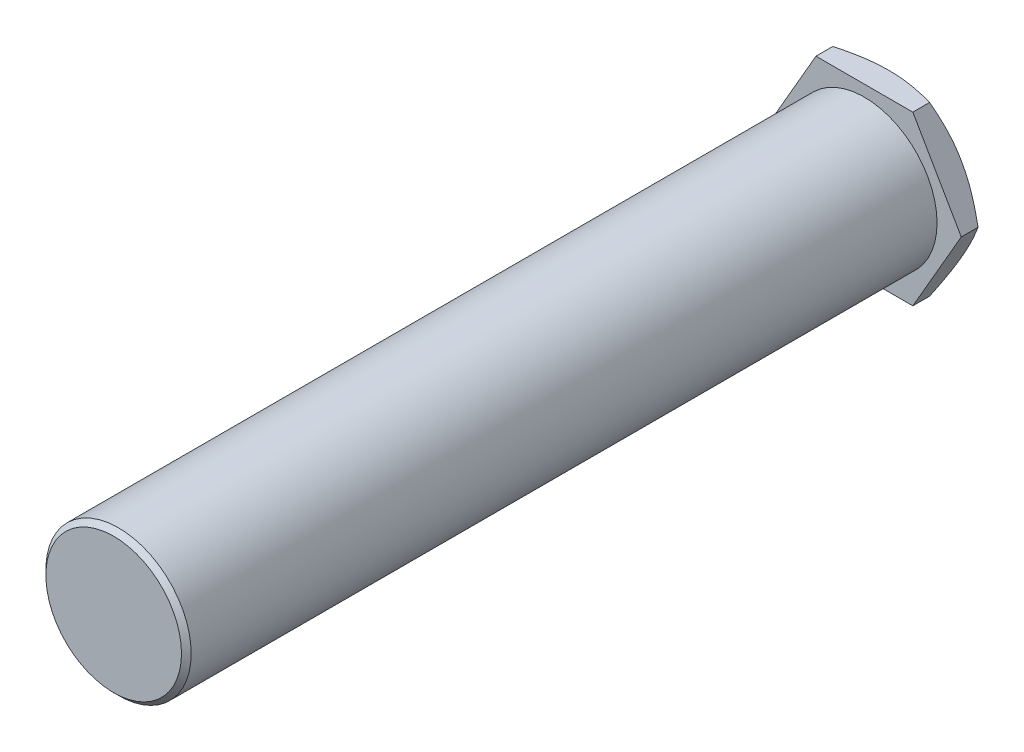
ISO-10303-21;
HEADER;
FILE_DESCRIPTION(('STEP AP214'),'2;1');
FILE_NAME('part.step','',(''),(''),'','','');
FILE_SCHEMA(('AUTOMOTIVE_DESIGN { 1 0 10303 214 1 1 1 1 }'));
ENDSEC;
DATA;
#1=APPLICATION_CONTEXT('core data for automotive mechanical design processes');
#2=APPLICATION_PROTOCOL_DEFINITION('international standard','automotive_design',2000,#1);
#3=PRODUCT_CONTEXT('',#1,'mechanical');
#4=PRODUCT('Part','Part','',(#3));
#5=PRODUCT_RELATED_PRODUCT_CATEGORY('part','',(#4));
#6=PRODUCT_DEFINITION_FORMATION('','',#4);
#7=PRODUCT_DEFINITION_CONTEXT('part definition',#1,'design');
#8=PRODUCT_DEFINITION('design','',#6,#7);
#9=PRODUCT_DEFINITION_SHAPE('','',#8);
#10=(LENGTH_UNIT() NAMED_UNIT(*) SI_UNIT(.MILLI.,.METRE.));
#11=(NAMED_UNIT(*) PLANE_ANGLE_UNIT() SI_UNIT($,.RADIAN.));
#12=(NAMED_UNIT(*) SI_UNIT($,.STERADIAN.) SOLID_ANGLE_UNIT());
#13=UNCERTAINTY_MEASURE_WITH_UNIT(LENGTH_MEASURE(1.E-05),#10,'distance_accuracy_value','');
#14=(GEOMETRIC_REPRESENTATION_CONTEXT(3) GLOBAL_UNCERTAINTY_ASSIGNED_CONTEXT((#13)) GLOBAL_UNIT_ASSIGNED_CONTEXT((#10,
#11,#12)) REPRESENTATION_CONTEXT('',''));
#15=CARTESIAN_POINT('',(0.,0.,0.));
#16=DIRECTION('',(0.,0.,1.));
#17=DIRECTION('',(1.,0.,0.));
#18=AXIS2_PLACEMENT_3D('',#15,#16,#17);
#19=CARTESIAN_POINT('',(20.,0.,5.));
#20=DIRECTION('',(-0.866025403784438,-0.5,0.));
#21=DIRECTION('',(0.5,-0.866025403784439,0.));
#22=AXIS2_PLACEMENT_3D('',#19,#20,#21);
#23=PLANE('',#22);
#24=DIRECTION('',(0.,0.,-1.));
#25=VECTOR('',#24,1.);
#26=CARTESIAN_POINT('',(20.,0.,5.));
#27=LINE('',#26,#25);
#28=CARTESIAN_POINT('',(20.,0.,5.));
#29=VERTEX_POINT('',#28);
#30=CARTESIAN_POINT('',(20.,0.,1.54700538379251));
#31=VERTEX_POINT('',#30);
#32=EDGE_CURVE('E136',#29,#31,#27,.T.);
#33=ORIENTED_EDGE('',*,*,#32,.T.);
#34=CARTESIAN_POINT('',(20.0001154700538,-0.000199999999996576,1.54707205103652));
#35=CARTESIAN_POINT('',(19.7803195510107,0.380497699078995,1.42018146576662));
#36=CARTESIAN_POINT('',(19.5596663098865,0.762680323560919,1.29904896621156));
#37=CARTESIAN_POINT('',(19.1165904501199,1.53011022428389,1.06990068375403));
#38=CARTESIAN_POINT('',(18.8941672750157,1.91535846434512,0.961889214905789));
#39=CARTESIAN_POINT('',(18.4471216714826,2.68966416296478,0.760434886450541));
#40=CARTESIAN_POINT('',(18.2224953309623,3.07872839746427,0.667026497786611));
#41=CARTESIAN_POINT('',(17.7716818242103,3.85956029589701,0.496784115818171));
#42=CARTESIAN_POINT('',(17.5454947481335,4.2513278036775,0.419949173295151));
#43=CARTESIAN_POINT('',(17.0973554522432,5.0275278330275,0.286121698015662));
#44=CARTESIAN_POINT('',(16.8754365022277,5.41190272961675,0.228686220289281));
#45=CARTESIAN_POINT('',(16.4305817358325,6.18241378700246,0.132379782936937));
#46=CARTESIAN_POINT('',(16.207645899963,6.56854998155616,0.0935091806497108));
#47=CARTESIAN_POINT('',(15.761399735147,7.34147101170028,0.0353139542598149));
#48=CARTESIAN_POINT('',(15.5380901685615,7.72825452684254,0.0159661036800531));
#49=CARTESIAN_POINT('',(15.0912649108274,8.50217857534305,-0.0027675315602278));
#50=CARTESIAN_POINT('',(14.8677492262615,8.88931909729985,-0.00215393304479378));
#51=CARTESIAN_POINT('',(14.4498812154448,9.61308772289198,0.0176412617727043));
#52=CARTESIAN_POINT('',(14.2554991166823,9.94976739403051,0.0344090109525736));
#53=CARTESIAN_POINT('',(13.8671985948881,10.6223236263835,0.0827234514403515));
#54=CARTESIAN_POINT('',(13.673280165256,10.9582001990305,0.114269931093043));
#55=CARTESIAN_POINT('',(13.2859804523275,11.6290229795794,0.191594441995724));
#56=CARTESIAN_POINT('',(13.0925998149688,11.9639680686847,0.237385342855899));
#57=CARTESIAN_POINT('',(12.7067591167219,12.6322637616762,0.342390664506991));
#58=CARTESIAN_POINT('',(12.5142990519364,12.9656143723127,0.401605028416829));
#59=CARTESIAN_POINT('',(11.9300616903803,13.9775431662078,0.600889320586829));
#60=CARTESIAN_POINT('',(11.5399762884739,14.6531909016006,0.760830493049639));
#61=CARTESIAN_POINT('',(10.765622066323,15.9944117574214,1.12383132955032));
#62=CARTESIAN_POINT('',(10.3813433320869,16.6600020493866,1.32680574399835));
#63=CARTESIAN_POINT('',(9.99988452994616,17.3207080756888,1.54707205103652));
#64=B_SPLINE_CURVE_WITH_KNOTS('',3,(#34,#35,#36,#37,#38,#39,#40,#41,#42,#43,#44,#45,#46,#47,#48,
#49,#50,#51,#52,#53,#54,#55,#56,#57,#58,#59,#60,#61,#62,#63),.UNSPECIFIED.,.F.,.F.,(4,2,2,2,2,2,
2,2,2,2,2,2,2,2,4),(0.,1.37265379434071,2.74575768798323,4.12205542001801,5.49827430578548,
6.84052513875048,8.182801806464,9.52347966022143,10.864116086047,12.0312115970818,
13.1982903939407,14.3664267057211,15.53455806769,17.9222758503161,20.3053069971282),.UNSPECIFIED.);
#65=CARTESIAN_POINT('',(15.,8.66025403784439,0.));
#66=VERTEX_POINT('',#65);
#67=EDGE_CURVE('E59',#31,#66,#64,.T.);
#68=ORIENTED_EDGE('',*,*,#67,.T.);
#69=CARTESIAN_POINT('',(10.,17.3205080756888,1.54700538379251));
#70=VERTEX_POINT('',#69);
#71=EDGE_CURVE('E109',#66,#70,#64,.T.);
#72=ORIENTED_EDGE('',*,*,#71,.T.);
#73=DIRECTION('',(0.,0.,-1.));
#74=VECTOR('',#73,1.);
#75=CARTESIAN_POINT('',(10.,17.3205080756888,5.));
#76=LINE('',#75,#74);
#77=CARTESIAN_POINT('',(10.,17.3205080756888,5.));
#78=VERTEX_POINT('',#77);
#79=EDGE_CURVE('E127',#78,#70,#76,.T.);
#80=ORIENTED_EDGE('',*,*,#79,.F.);
#81=DIRECTION('',(-0.5,0.866025403784438,0.));
#82=VECTOR('',#81,1.);
#83=CARTESIAN_POINT('',(20.,0.,5.));
#84=LINE('',#83,#82);
#85=EDGE_CURVE('E137',#29,#78,#84,.T.);
#86=ORIENTED_EDGE('',*,*,#85,.F.);
#87=EDGE_LOOP('',(#33,#68,#72,#80,#86));
#88=FACE_BOUND('',#87,.T.);
#89=ADVANCED_FACE('F37',(#88),#23,.F.);
#90=CARTESIAN_POINT('',(10.,17.3205080756888,5.));
#91=DIRECTION('',(0.,-1.,0.));
#92=DIRECTION('',(1.,0.,0.));
#93=AXIS2_PLACEMENT_3D('',#90,#91,#92);
#94=PLANE('',#93);
#95=ORIENTED_EDGE('',*,*,#79,.T.);
#96=CARTESIAN_POINT('',(-27.0034122350817,17.3205080756888,8.52191739838469));
#97=CARTESIAN_POINT('',(-26.6245824192709,17.3205080756888,8.3378202379954));
#98=CARTESIAN_POINT('',(-26.2453118989387,17.3205080756888,8.15463037370527));
#99=CARTESIAN_POINT('',(-25.4857975352107,17.3205080756888,7.79027043891044));
#100=CARTESIAN_POINT('',(-25.1055536822809,17.3205080756888,7.60910038828447));
#101=CARTESIAN_POINT('',(-23.9631249567054,17.3205080756888,7.06888092926367));
#102=CARTESIAN_POINT('',(-23.1993527846695,17.3205080756888,6.71317575029368));
#103=CARTESIAN_POINT('',(-21.6626558697243,17.3205080756888,6.01092247214673));
#104=CARTESIAN_POINT('',(-20.8897040215627,17.3205080756888,5.66443354540436));
#105=CARTESIAN_POINT('',(-19.3377031515632,17.3205080756888,4.9854402327627));
#106=CARTESIAN_POINT('',(-18.5586544156271,17.3205080756888,4.6529351957214));
#107=CARTESIAN_POINT('',(-16.9674942059672,17.3205080756888,3.99496698160882));
#108=CARTESIAN_POINT('',(-16.1551373871229,17.3205080756888,3.67009406571393));
#109=CARTESIAN_POINT('',(-14.5209665604173,17.3205080756888,3.04459199123297));
#110=CARTESIAN_POINT('',(-13.6991515104975,17.3205080756888,2.74396553378702));
#111=CARTESIAN_POINT('',(-12.046276184507,17.3205080756888,2.17474929277727));
#112=CARTESIAN_POINT('',(-11.2152380039833,17.3205080756888,1.90609585788));
#113=CARTESIAN_POINT('',(-9.5411627871852,17.3205080756888,1.409336609569));
#114=CARTESIAN_POINT('',(-8.69812957472203,17.3205080756888,1.1812181737987));
#115=CARTESIAN_POINT('',(-7.42677386475412,17.3205080756888,0.878254160301244));
#116=CARTESIAN_POINT('',(-7.00304677633097,17.3205080756888,0.7840107545032));
#117=CARTESIAN_POINT('',(-6.15267110178526,17.3205080756888,0.609702596917993));
#118=CARTESIAN_POINT('',(-5.72602257443168,17.3205080756888,0.529637560777663));
#119=CARTESIAN_POINT('',(-4.87008681739914,17.3205080756888,0.385090375556851));
#120=CARTESIAN_POINT('',(-4.4407996254225,17.3205080756888,0.320608004353295));
#121=CARTESIAN_POINT('',(-3.58003259291659,17.3205080756888,0.208507494296436));
#122=CARTESIAN_POINT('',(-3.14855284919349,17.3205080756888,0.160888617332256));
#123=CARTESIAN_POINT('',(-2.28969608063912,17.3205080756888,0.0840656415625298));
#124=CARTESIAN_POINT('',(-1.8623402140063,17.3205080756888,0.0546264519192978));
#125=CARTESIAN_POINT('',(-1.00676682079647,17.3205080756888,0.0138544337597063));
#126=CARTESIAN_POINT('',(-0.57854930882484,17.3205080756888,0.00252130088132875));
#127=CARTESIAN_POINT('',(0.277981706420849,17.3205080756888,-0.00176847435307976));
#128=CARTESIAN_POINT('',(0.706295209904944,17.3205080756888,0.00527492390100299));
#129=CARTESIAN_POINT('',(1.56224042860188,17.3205080756888,0.0375646448342995));
#130=CARTESIAN_POINT('',(1.98987211247299,17.3205080756888,0.0628117814222773));
#131=CARTESIAN_POINT('',(3.01333384123616,17.3205080756888,0.144481140822326));
#132=CARTESIAN_POINT('',(3.6085057105198,17.3205080756888,0.209302924109661));
#133=CARTESIAN_POINT('',(4.79452902002576,17.3205080756888,0.370711593038908));
#134=CARTESIAN_POINT('',(5.38537987826681,17.3205080756888,0.4673026798638));
#135=CARTESIAN_POINT('',(6.56216520831207,17.3205080756888,0.688814112042596));
#136=CARTESIAN_POINT('',(7.14809556034438,17.3205080756888,0.813756135466057));
#137=CARTESIAN_POINT('',(8.31412617929927,17.3205080756888,1.08814866091658));
#138=CARTESIAN_POINT('',(8.89422652653913,17.3205080756888,1.23759882481366));
#139=CARTESIAN_POINT('',(10.061429276607,17.3205080756888,1.56091543159389));
#140=CARTESIAN_POINT('',(10.6484009591397,17.3205080756888,1.73525051600157));
#141=CARTESIAN_POINT('',(11.8165641271816,17.3205080756888,2.10221758448787));
#142=CARTESIAN_POINT('',(12.3977555740429,17.3205080756888,2.29484969081406));
#143=CARTESIAN_POINT('',(13.5546404194593,17.3205080756888,2.69532743137351));
#144=CARTESIAN_POINT('',(14.1303355117933,17.3205080756888,2.90316819574816));
#145=CARTESIAN_POINT('',(15.2769366025492,17.3205080756888,3.33159025682286));
#146=CARTESIAN_POINT('',(15.8478426606714,17.3205080756888,3.55217139442967));
#147=CARTESIAN_POINT('',(17.2086386393179,17.3205080756888,4.09262574044288));
#148=CARTESIAN_POINT('',(17.9965420070188,17.3205080756888,4.41749367250325));
#149=CARTESIAN_POINT('',(19.5655080290175,17.3205080756888,5.08339672615071));
#150=CARTESIAN_POINT('',(20.3465702285645,17.3205080756888,5.42443291296594));
#151=CARTESIAN_POINT('',(21.9031480922398,17.3205080756888,6.1193921468403));
#152=CARTESIAN_POINT('',(22.6786623885965,17.3205080756888,6.47331824907948));
#153=CARTESIAN_POINT('',(24.2248968780348,17.3205080756888,7.19142033534023));
#154=CARTESIAN_POINT('',(24.9956171805425,17.3205080756888,7.55559608435057));
#155=CARTESIAN_POINT('',(26.5339519086921,17.3205080756888,8.29267905062406));
#156=CARTESIAN_POINT('',(27.3015617542827,17.3205080756888,8.66559580967092));
#157=CARTESIAN_POINT('',(28.83343092219,17.3205080756888,9.41824767103164));
#158=CARTESIAN_POINT('',(29.597690229006,17.3205080756888,9.79798280484835));
#159=CARTESIAN_POINT('',(31.1232768541779,17.3205080756888,10.5630373487233));
#160=CARTESIAN_POINT('',(31.8846045535034,17.3205080756888,10.9483559999032));
#161=CARTESIAN_POINT('',(33.404854370183,17.3205080756888,11.723701393457));
#162=CARTESIAN_POINT('',(34.1637764922996,17.3205080756888,12.1137281265024));
#163=CARTESIAN_POINT('',(36.3075847506814,17.3205080756888,13.222547656709));
#164=CARTESIAN_POINT('',(37.6900772707338,17.3205080756888,13.9459681355234));
#165=CARTESIAN_POINT('',(40.4499205378925,17.3205080756888,15.4026531136403));
#166=CARTESIAN_POINT('',(41.8272710889397,17.3205080756888,16.1359179834996));
#167=CARTESIAN_POINT('',(44.5743700924625,17.3205080756888,17.6080540716992));
#168=CARTESIAN_POINT('',(45.9441289975342,17.3205080756888,18.34690579827));
#169=CARTESIAN_POINT('',(47.9963487686098,17.3205080756888,19.459545628748));
#170=CARTESIAN_POINT('',(48.6799996550839,17.3205080756888,19.831142056522));
#171=CARTESIAN_POINT('',(50.046587527182,17.3205080756888,20.5756429284366));
#172=CARTESIAN_POINT('',(50.7295245139095,17.3205080756888,20.9485473705515));
#173=CARTESIAN_POINT('',(51.4121452721651,17.3205080756888,21.3220299548959));
#174=B_SPLINE_CURVE_WITH_KNOTS('',3,(#96,#97,#98,#99,#100,#101,#102,#103,#104,#105,#106,#107,
#108,#109,#110,#111,#112,#113,#114,#115,#116,#117,#118,#119,#120,#121,#122,#123,#124,#125,#126,
#127,#128,#129,#130,#131,#132,#133,#134,#135,#136,#137,#138,#139,#140,#141,#142,#143,#144,#145,
#146,#147,#148,#149,#150,#151,#152,#153,#154,#155,#156,#157,#158,#159,#160,#161,#162,#163,#164,
#165,#166,#167,#168,#169,#170,#171,#172,#173),.UNSPECIFIED.,.F.,.F.,(4,2,2,2,2,2,2,2,2,2,2,2,2,
2,2,2,2,2,2,2,2,2,2,2,2,2,2,2,2,2,2,2,2,2,2,2,2,2,4),(0.,1.26357764833024,2.52716772166211,
5.0547144991967,7.59578382478248,10.1367346974143,12.7611665728803,15.3858904165347,
18.0052983576343,20.6238891958676,21.9259338905071,23.2279524691345,24.5299524870452,
25.831895509699,27.1166291415962,28.4013411769504,29.6860560513793,30.9708283703574,
32.765912535535,34.5612341787303,36.3579332382741,38.1546075114943,39.9911937386535,
41.8277922374278,43.6638052036867,45.4997952480008,48.0562997907698,50.6129730008055,
53.1702561909485,55.7274807935681,58.2876404444749,60.8478119271032,63.4076386508626,
65.9674603035565,70.6483833881871,75.3294831661351,79.998432769144,82.3327757262931,
84.6671150699862),.UNSPECIFIED.);
#175=CARTESIAN_POINT('',(0.,17.3205080756888,0.));
#176=VERTEX_POINT('',#175);
#177=EDGE_CURVE('E115',#70,#176,#174,.F.);
#178=ORIENTED_EDGE('',*,*,#177,.T.);
#179=CARTESIAN_POINT('',(-10.,17.3205080756888,1.54700538379251));
#180=VERTEX_POINT('',#179);
#181=EDGE_CURVE('E146',#176,#180,#174,.F.);
#182=ORIENTED_EDGE('',*,*,#181,.T.);
#183=DIRECTION('',(0.,0.,-1.));
#184=VECTOR('',#183,1.);
#185=CARTESIAN_POINT('',(-10.,17.3205080756888,5.));
#186=LINE('',#185,#184);
#187=CARTESIAN_POINT('',(-10.,17.3205080756888,5.));
#188=VERTEX_POINT('',#187);
#189=EDGE_CURVE('E208',#188,#180,#186,.T.);
#190=ORIENTED_EDGE('',*,*,#189,.F.);
#191=DIRECTION('',(-1.,0.,0.));
#192=VECTOR('',#191,1.);
#193=CARTESIAN_POINT('',(10.,17.3205080756888,5.));
#194=LINE('',#193,#192);
#195=EDGE_CURVE('E139',#78,#188,#194,.T.);
#196=ORIENTED_EDGE('',*,*,#195,.F.);
#197=EDGE_LOOP('',(#95,#178,#182,#190,#196));
#198=FACE_BOUND('',#197,.T.);
#199=ADVANCED_FACE('F197',(#198),#94,.F.);
#200=CARTESIAN_POINT('',(-10.,17.3205080756888,5.));
#201=DIRECTION('',(0.866025403784439,-0.5,0.));
#202=DIRECTION('',(0.5,0.866025403784439,0.));
#203=AXIS2_PLACEMENT_3D('',#200,#201,#202);
#204=PLANE('',#203);
#205=ORIENTED_EDGE('',*,*,#189,.T.);
#206=CARTESIAN_POINT('',(-9.99988452994616,17.3207080756888,1.54707205103652));
#207=CARTESIAN_POINT('',(-10.2196804489893,16.9400103766098,1.42018146576662));
#208=CARTESIAN_POINT('',(-10.4403336901135,16.5578277521279,1.29904896621156));
#209=CARTESIAN_POINT('',(-10.8834095498801,15.7903978514049,1.06990068375403));
#210=CARTESIAN_POINT('',(-11.1058327249843,15.4051496113437,0.961889214905789));
#211=CARTESIAN_POINT('',(-11.5528783285174,14.630843912724,0.76043488645054));
#212=CARTESIAN_POINT('',(-11.7775046690377,14.2417796782245,0.667026497786611));
#213=CARTESIAN_POINT('',(-12.2283181757897,13.4609477797918,0.49678411581817));
#214=CARTESIAN_POINT('',(-12.4545052518665,13.0691802720113,0.41994917329515));
#215=CARTESIAN_POINT('',(-12.9026445477568,12.2929802426613,0.286121698015661));
#216=CARTESIAN_POINT('',(-13.1245634977723,11.908605346072,0.228686220289279));
#217=CARTESIAN_POINT('',(-13.5694182641675,11.1380942886863,0.132379782936935));
#218=CARTESIAN_POINT('',(-13.792354100037,10.7519580941326,0.0935091806497088));
#219=CARTESIAN_POINT('',(-14.238600264853,9.9790370639885,0.0353139542598128));
#220=CARTESIAN_POINT('',(-14.4619098314385,9.59225354884624,0.0159661036800511));
#221=CARTESIAN_POINT('',(-14.9087350891726,8.81832950034572,-0.00276753156022876));
#222=CARTESIAN_POINT('',(-15.1322507737385,8.43118897838893,-0.00215393304479375));
#223=CARTESIAN_POINT('',(-15.5501187845552,7.7074203527968,0.0176412617727043));
#224=CARTESIAN_POINT('',(-15.7445008833177,7.37074068165826,0.0344090109525729));
#225=CARTESIAN_POINT('',(-16.1328014051119,6.69818444930524,0.0827234514403501));
#226=CARTESIAN_POINT('',(-16.326719834744,6.36230787665833,0.114269931093042));
#227=CARTESIAN_POINT('',(-16.7140195476725,5.6914850961094,0.191594441995722));
#228=CARTESIAN_POINT('',(-16.9074001850312,5.35654000700407,0.237385342855897));
#229=CARTESIAN_POINT('',(-17.2932408832781,4.6882443140126,0.342390664506989));
#230=CARTESIAN_POINT('',(-17.4857009480636,4.35489370337607,0.401605028416828));
#231=CARTESIAN_POINT('',(-18.0699383096197,3.34296490948102,0.60088932058683));
#232=CARTESIAN_POINT('',(-18.4600237115261,2.66731717408818,0.760830493049638));
#233=CARTESIAN_POINT('',(-19.2343779336769,1.32609631826739,1.12383132955032));
#234=CARTESIAN_POINT('',(-19.6186566679131,0.660506026302148,1.32680574399834));
#235=CARTESIAN_POINT('',(-20.0001154700538,-0.000200000000003235,1.54707205103652));
#236=B_SPLINE_CURVE_WITH_KNOTS('',3,(#206,#207,#208,#209,#210,#211,#212,#213,#214,#215,#216,
#217,#218,#219,#220,#221,#222,#223,#224,#225,#226,#227,#228,#229,#230,#231,#232,#233,#234,#235),
.UNSPECIFIED.,.F.,.F.,(4,2,2,2,2,2,2,2,2,2,2,2,2,2,4),(0.,1.37265379434071,2.74575768798323,
4.12205542001802,5.49827430578548,6.84052513875049,8.182801806464,9.52347966022143,
10.864116086047,12.0312115970818,13.1982903939407,14.3664267057211,15.53455806769,
17.9222758503161,20.3053069971282),.UNSPECIFIED.);
#237=CARTESIAN_POINT('',(-15.,8.66025403784438,0.));
#238=VERTEX_POINT('',#237);
#239=EDGE_CURVE('E191',#180,#238,#236,.T.);
#240=ORIENTED_EDGE('',*,*,#239,.T.);
#241=CARTESIAN_POINT('',(-20.,0.,1.54700538379251));
#242=VERTEX_POINT('',#241);
#243=EDGE_CURVE('E185',#238,#242,#236,.T.);
#244=ORIENTED_EDGE('',*,*,#243,.T.);
#245=DIRECTION('',(0.,0.,-1.));
#246=VECTOR('',#245,1.);
#247=CARTESIAN_POINT('',(-20.,0.,5.));
#248=LINE('',#247,#246);
#249=CARTESIAN_POINT('',(-20.,0.,5.));
#250=VERTEX_POINT('',#249);
#251=EDGE_CURVE('E211',#250,#242,#248,.T.);
#252=ORIENTED_EDGE('',*,*,#251,.F.);
#253=DIRECTION('',(-0.5,-0.866025403784439,0.));
#254=VECTOR('',#253,1.);
#255=CARTESIAN_POINT('',(-10.,17.3205080756888,5.));
#256=LINE('',#255,#254);
#257=EDGE_CURVE('E390',#188,#250,#256,.T.);
#258=ORIENTED_EDGE('',*,*,#257,.F.);
#259=EDGE_LOOP('',(#205,#240,#244,#252,#258));
#260=FACE_BOUND('',#259,.T.);
#261=ADVANCED_FACE('F193',(#260),#204,.F.);
#262=CARTESIAN_POINT('',(-20.,0.,5.));
#263=DIRECTION('',(0.866025403784439,0.5,0.));
#264=DIRECTION('',(-0.5,0.866025403784439,0.));
#265=AXIS2_PLACEMENT_3D('',#262,#263,#264);
#266=PLANE('',#265);
#267=ORIENTED_EDGE('',*,*,#251,.T.);
#268=CARTESIAN_POINT('',(-20.0001154700538,0.000199999999995546,1.54707205103652));
#269=CARTESIAN_POINT('',(-19.7803195510107,-0.380497699078997,1.42018146576661));
#270=CARTESIAN_POINT('',(-19.5596663098865,-0.762680323560922,1.29904896621155));
#271=CARTESIAN_POINT('',(-19.1165904501199,-1.53011022428389,1.06990068375403));
#272=CARTESIAN_POINT('',(-18.8941672750157,-1.91535846434513,0.961889214905784));
#273=CARTESIAN_POINT('',(-18.4471216714826,-2.68966416296479,0.760434886450536));
#274=CARTESIAN_POINT('',(-18.2224953309623,-3.07872839746427,0.667026497786607));
#275=CARTESIAN_POINT('',(-17.7716818242103,-3.85956029589702,0.496784115818167));
#276=CARTESIAN_POINT('',(-17.5454947481335,-4.2513278036775,0.419949173295146));
#277=CARTESIAN_POINT('',(-17.0973554522432,-5.0275278330275,0.286121698015658));
#278=CARTESIAN_POINT('',(-16.8754365022277,-5.41190272961675,0.228686220289278));
#279=CARTESIAN_POINT('',(-16.4305817358325,-6.18241378700246,0.132379782936933));
#280=CARTESIAN_POINT('',(-16.207645899963,-6.56854998155616,0.0935091806497055));
#281=CARTESIAN_POINT('',(-15.761399735147,-7.34147101170028,0.0353139542598102));
#282=CARTESIAN_POINT('',(-15.5380901685615,-7.72825452684254,0.0159661036800503));
#283=CARTESIAN_POINT('',(-15.0912649108274,-8.50217857534305,-0.00276753156022894));
#284=CARTESIAN_POINT('',(-14.8677492262614,-8.88931909729985,-0.00215393304479503));
#285=CARTESIAN_POINT('',(-14.4498812154448,-9.61308772289198,0.0176412617727026));
#286=CARTESIAN_POINT('',(-14.2554991166823,-9.94976739403051,0.0344090109525716));
#287=CARTESIAN_POINT('',(-13.8671985948881,-10.6223236263835,0.0827234514403495));
#288=CARTESIAN_POINT('',(-13.673280165256,-10.9582001990305,0.114269931093042));
#289=CARTESIAN_POINT('',(-13.2859804523275,-11.6290229795794,0.191594441995722));
#290=CARTESIAN_POINT('',(-13.0925998149688,-11.9639680686847,0.237385342855897));
#291=CARTESIAN_POINT('',(-12.7067591167219,-12.6322637616762,0.342390664506989));
#292=CARTESIAN_POINT('',(-12.5142990519364,-12.9656143723127,0.401605028416827));
#293=CARTESIAN_POINT('',(-11.9300616903803,-13.9775431662078,0.600889320586827));
#294=CARTESIAN_POINT('',(-11.5399762884739,-14.6531909016006,0.760830493049637));
#295=CARTESIAN_POINT('',(-10.765622066323,-15.9944117574214,1.12383132955032));
#296=CARTESIAN_POINT('',(-10.3813433320869,-16.6600020493866,1.32680574399835));
#297=CARTESIAN_POINT('',(-9.99988452994615,-17.3207080756888,1.54707205103652));
#298=B_SPLINE_CURVE_WITH_KNOTS('',3,(#268,#269,#270,#271,#272,#273,#274,#275,#276,#277,#278,
#279,#280,#281,#282,#283,#284,#285,#286,#287,#288,#289,#290,#291,#292,#293,#294,#295,#296,#297),
.UNSPECIFIED.,.F.,.F.,(4,2,2,2,2,2,2,2,2,2,2,2,2,2,4),(0.,1.37265379434071,2.74575768798323,
4.12205542001802,5.49827430578548,6.84052513875048,8.182801806464,9.52347966022142,
10.8641160860469,12.0312115970818,13.1982903939407,14.3664267057211,15.53455806769,
17.9222758503161,20.3053069971282),.UNSPECIFIED.);
#299=CARTESIAN_POINT('',(-15.,-8.66025403784439,0.));
#300=VERTEX_POINT('',#299);
#301=EDGE_CURVE('E192',#242,#300,#298,.T.);
#302=ORIENTED_EDGE('',*,*,#301,.T.);
#303=CARTESIAN_POINT('',(-9.99999999999999,-17.3205080756888,1.54700538379251));
#304=VERTEX_POINT('',#303);
#305=EDGE_CURVE('E180',#300,#304,#298,.T.);
#306=ORIENTED_EDGE('',*,*,#305,.T.);
#307=DIRECTION('',(0.,0.,-1.));
#308=VECTOR('',#307,1.);
#309=CARTESIAN_POINT('',(-9.99999999999999,-17.3205080756888,5.));
#310=LINE('',#309,#308);
#311=CARTESIAN_POINT('',(-9.99999999999999,-17.3205080756888,5.));
#312=VERTEX_POINT('',#311);
#313=EDGE_CURVE('E388',#312,#304,#310,.T.);
#314=ORIENTED_EDGE('',*,*,#313,.F.);
#315=DIRECTION('',(0.5,-0.866025403784438,0.));
#316=VECTOR('',#315,1.);
#317=CARTESIAN_POINT('',(-20.,0.,5.));
#318=LINE('',#317,#316);
#319=EDGE_CURVE('E383',#250,#312,#318,.T.);
#320=ORIENTED_EDGE('',*,*,#319,.F.);
#321=EDGE_LOOP('',(#267,#302,#306,#314,#320));
#322=FACE_BOUND('',#321,.T.);
#323=ADVANCED_FACE('F196',(#322),#266,.F.);
#324=CARTESIAN_POINT('',(-9.99999999999999,-17.3205080756888,5.));
#325=DIRECTION('',(0.,1.,0.));
#326=DIRECTION('',(0.,0.,1.));
#327=AXIS2_PLACEMENT_3D('',#324,#325,#326);
#328=PLANE('',#327);
#329=ORIENTED_EDGE('',*,*,#313,.T.);
#330=CARTESIAN_POINT('',(-27.0034122326066,-17.3205080756888,8.52191739718187));
#331=CARTESIAN_POINT('',(-26.6245824168374,-17.3205080756888,8.3378202368177));
#332=CARTESIAN_POINT('',(-26.2453118965468,-17.3205080756888,8.15463037255269));
#333=CARTESIAN_POINT('',(-25.4857975329021,-17.3205080756888,7.79027043780805));
#334=CARTESIAN_POINT('',(-25.1055536800139,-17.3205080756888,7.60910038720715));
#335=CARTESIAN_POINT('',(-23.9631249545634,-17.3205080756888,7.06888092826149));
#336=CARTESIAN_POINT('',(-23.199352782611,-17.3205080756888,6.71317574934148));
#337=CARTESIAN_POINT('',(-21.6626558678341,-17.3205080756888,6.01092247129453));
#338=CARTESIAN_POINT('',(-20.8897040197573,-17.3205080756888,5.66443354460216));
#339=CARTESIAN_POINT('',(-19.337703149928,-17.3205080756888,4.98544023205968));
#340=CARTESIAN_POINT('',(-18.5586544140773,-17.3205080756888,4.65293519506756));
#341=CARTESIAN_POINT('',(-16.9674942045947,-17.3205080756888,3.99496698105468));
#342=CARTESIAN_POINT('',(-16.1551373858423,-17.3205080756888,3.67009406521021));
#343=CARTESIAN_POINT('',(-14.5209665593222,-17.3205080756888,3.04459199082738));
#344=CARTESIAN_POINT('',(-13.6991515094958,-17.3205080756888,2.74396553342915));
#345=CARTESIAN_POINT('',(-12.0462761836941,-17.3205080756888,2.17474929251022));
#346=CARTESIAN_POINT('',(-11.2152380032656,-17.3205080756888,1.90609585765607));
#347=CARTESIAN_POINT('',(-9.54116278666046,-17.3205080756888,1.40933660942422));
#348=CARTESIAN_POINT('',(-8.69812957429512,-17.3205080756888,1.18121817368996));
#349=CARTESIAN_POINT('',(-7.42677386449994,-17.3205080756888,0.87825416024415));
#350=CARTESIAN_POINT('',(-7.00304677615072,-17.3205080756888,0.784010754465028));
#351=CARTESIAN_POINT('',(-6.15267110175394,-17.3205080756888,0.609702596912796));
#352=CARTESIAN_POINT('',(-5.72602257447534,-17.3205080756888,0.529637560786521));
#353=CARTESIAN_POINT('',(-4.87008681759359,-17.3205080756888,0.385090375588202));
#354=CARTESIAN_POINT('',(-4.44079962569275,-17.3205080756888,0.320608004393088));
#355=CARTESIAN_POINT('',(-3.58003259333907,-17.3205080756888,0.208507494346864));
#356=CARTESIAN_POINT('',(-3.14855284969241,-17.3205080756888,0.16088861738488));
#357=CARTESIAN_POINT('',(-2.28969608128931,-17.3205080756888,0.0840656416127973));
#358=CARTESIAN_POINT('',(-1.86234021473133,-17.3205080756888,0.0546264519651373));
#359=CARTESIAN_POINT('',(-1.006766821671,-17.3205080756888,0.0138544337900941));
#360=CARTESIAN_POINT('',(-0.578549309774034,-17.3205080756888,0.00252130090069312));
#361=CARTESIAN_POINT('',(0.27798170532288,-17.3205080756888,-0.00176847436218962));
#362=CARTESIAN_POINT('',(0.706295208732868,-17.3205080756888,0.00527492387444075));
#363=CARTESIAN_POINT('',(1.56224042728257,-17.3205080756888,0.03756464476687));
#364=CARTESIAN_POINT('',(1.98987211108057,-17.3205080756888,0.0628117813314328));
#365=CARTESIAN_POINT('',(3.01333383973011,-17.3205080756888,0.144481140673867));
#366=CARTESIAN_POINT('',(3.60850570897359,-17.3205080756888,0.209302923927981));
#367=CARTESIAN_POINT('',(4.79452901840102,-17.3205080756888,0.370711592789015));
#368=CARTESIAN_POINT('',(5.38537987660372,-17.3205080756888,0.467302679578916));
#369=CARTESIAN_POINT('',(6.56216520657365,-17.3205080756888,0.68881411168717));
#370=CARTESIAN_POINT('',(7.148095558569,-17.3205080756888,0.813756135075078));
#371=CARTESIAN_POINT('',(8.31412617745102,-17.3205080756888,1.08814866045483));
#372=CARTESIAN_POINT('',(8.89422652465499,-17.3205080756888,1.23759882431669));
#373=CARTESIAN_POINT('',(10.0614292746501,-17.3205080756888,1.56091543102632));
#374=CARTESIAN_POINT('',(10.6484009571459,-17.3205080756888,1.73525051539861));
#375=CARTESIAN_POINT('',(11.8165641251146,-17.3205080756888,2.1022175838152));
#376=CARTESIAN_POINT('',(12.3977555719394,-17.3205080756888,2.29484969010707));
#377=CARTESIAN_POINT('',(13.5546404172832,-17.3205080756888,2.69532743059907));
#378=CARTESIAN_POINT('',(14.1303355095811,-17.3205080756888,2.90316819494061));
#379=CARTESIAN_POINT('',(15.2769366002646,-17.3205080756888,3.33159025595019));
#380=CARTESIAN_POINT('',(15.8478426583506,-17.3205080756888,3.552171393525));
#381=CARTESIAN_POINT('',(17.2086386369725,-17.3205080756888,4.09262573948758));
#382=CARTESIAN_POINT('',(17.9965420046844,-17.3205080756888,4.41749367153141));
#383=CARTESIAN_POINT('',(19.5655080267036,-17.3205080756888,5.08339672514975));
#384=CARTESIAN_POINT('',(20.3465702262603,-17.3205080756888,5.4244329119524));
#385=CARTESIAN_POINT('',(21.903148089954,-17.3205080756888,6.1193921458046));
#386=CARTESIAN_POINT('',(22.6786623863194,-17.3205080756888,6.47331824803421));
#387=CARTESIAN_POINT('',(24.2248968757741,-17.3205080756888,7.19142033427807));
#388=CARTESIAN_POINT('',(24.9956171782896,-17.3205080756888,7.55559608328111));
#389=CARTESIAN_POINT('',(26.5339519064544,-17.3205080756888,8.29267904954187));
#390=CARTESIAN_POINT('',(27.3015617520524,-17.3205080756888,8.66559580858333));
#391=CARTESIAN_POINT('',(28.833430919974,-17.3205080756888,9.4182476699346));
#392=CARTESIAN_POINT('',(29.5976902267967,-17.3205080756888,9.79798280374726));
#393=CARTESIAN_POINT('',(31.1232768519817,-17.3205080756888,10.5630373476151));
#394=CARTESIAN_POINT('',(31.8846045513135,-17.3205080756888,10.9483559987921));
#395=CARTESIAN_POINT('',(33.4048543680053,-17.3205080756888,11.7237013923406));
#396=CARTESIAN_POINT('',(34.1637764901278,-17.3205080756888,12.1137281253838));
#397=CARTESIAN_POINT('',(36.3075847485175,-17.3205080756888,13.2225476555811));
#398=CARTESIAN_POINT('',(37.6900772685717,-17.3205080756888,13.9459681343888));
#399=CARTESIAN_POINT('',(40.4499205357332,-17.3205080756888,15.402653112494));
#400=CARTESIAN_POINT('',(41.8272710867815,-17.3205080756888,16.1359179823481));
#401=CARTESIAN_POINT('',(44.5743700903044,-17.3205080756888,17.6080540705376));
#402=CARTESIAN_POINT('',(45.9441289953752,-17.3205080756888,18.3469057971034));
#403=CARTESIAN_POINT('',(47.9963487664491,-17.3205080756888,19.4595456275746));
#404=CARTESIAN_POINT('',(48.6799996529226,-17.3205080756888,19.8311420553464));
#405=CARTESIAN_POINT('',(50.0465875250193,-17.3205080756888,20.5756429272566));
#406=CARTESIAN_POINT('',(50.7295245117462,-17.3205080756888,20.9485473693695));
#407=CARTESIAN_POINT('',(51.412145270001,-17.3205080756888,21.3220299537119));
#408=B_SPLINE_CURVE_WITH_KNOTS('',3,(#330,#331,#332,#333,#334,#335,#336,#337,#338,#339,#340,
#341,#342,#343,#344,#345,#346,#347,#348,#349,#350,#351,#352,#353,#354,#355,#356,#357,#358,#359,
#360,#361,#362,#363,#364,#365,#366,#367,#368,#369,#370,#371,#372,#373,#374,#375,#376,#377,#378,
#379,#380,#381,#382,#383,#384,#385,#386,#387,#388,#389,#390,#391,#392,#393,#394,#395,#396,#397,
#398,#399,#400,#401,#402,#403,#404,#405,#406,#407),.UNSPECIFIED.,.F.,.F.,(4,2,2,2,2,2,2,2,2,2,2,
2,2,2,2,2,2,2,2,2,2,2,2,2,2,2,2,2,2,2,2,2,2,2,2,2,2,2,4),(0.,1.26357764818508,2.52716772137179,
5.05471449861602,7.5957838239083,10.1367346962467,12.7611665714002,15.3858904147422,
18.0052983555304,20.6238891934526,21.9259338878634,23.2279524662621,24.5299524839443,
25.8318955063696,27.116629138044,28.4013411731753,29.6860560473813,30.9708283661364,
32.7659125311836,34.5612341742484,36.3579332336615,38.1546075067509,39.9911937337739,
41.827792232412,43.663805198535,45.4997952427132,48.0562997854935,50.6129729955407,
53.1702561856954,55.7274807883267,58.2876404392464,60.8478119218876,63.4076386456597,
65.9674602983663,70.6483833829924,75.3294831609359,79.9984327639353,82.3327757210796,
84.6671150647679),.UNSPECIFIED.);
#409=CARTESIAN_POINT('',(0.,-17.3205080756888,0.));
#410=VERTEX_POINT('',#409);
#411=EDGE_CURVE('E367',#304,#410,#408,.T.);
#412=ORIENTED_EDGE('',*,*,#411,.T.);
#413=CARTESIAN_POINT('',(10.,-17.3205080756888,1.54700538379251));
#414=VERTEX_POINT('',#413);
#415=EDGE_CURVE('E174',#410,#414,#408,.T.);
#416=ORIENTED_EDGE('',*,*,#415,.T.);
#417=DIRECTION('',(0.,0.,-1.));
#418=VECTOR('',#417,1.);
#419=CARTESIAN_POINT('',(10.,-17.3205080756888,5.));
#420=LINE('',#419,#418);
#421=CARTESIAN_POINT('',(10.,-17.3205080756888,5.));
#422=VERTEX_POINT('',#421);
#423=EDGE_CURVE('E377',#422,#414,#420,.T.);
#424=ORIENTED_EDGE('',*,*,#423,.F.);
#425=DIRECTION('',(1.,0.,0.));
#426=VECTOR('',#425,1.);
#427=CARTESIAN_POINT('',(-9.99999999999999,-17.3205080756888,5.));
#428=LINE('',#427,#426);
#429=EDGE_CURVE('E381',#312,#422,#428,.T.);
#430=ORIENTED_EDGE('',*,*,#429,.F.);
#431=EDGE_LOOP('',(#329,#412,#416,#424,#430));
#432=FACE_BOUND('',#431,.T.);
#433=ADVANCED_FACE('F264',(#432),#328,.F.);
#434=CARTESIAN_POINT('',(10.,-17.3205080756888,5.));
#435=DIRECTION('',(-0.866025403784439,0.5,0.));
#436=DIRECTION('',(-0.5,-0.866025403784439,0.));
#437=AXIS2_PLACEMENT_3D('',#434,#435,#436);
#438=PLANE('',#437);
#439=ORIENTED_EDGE('',*,*,#423,.T.);
#440=CARTESIAN_POINT('',(9.99988452994616,-17.3207080756888,1.54707205103652));
#441=CARTESIAN_POINT('',(10.2196804489893,-16.9400103766098,1.42018146576662));
#442=CARTESIAN_POINT('',(10.4403336901135,-16.5578277521279,1.29904896621156));
#443=CARTESIAN_POINT('',(10.8834095498801,-15.7903978514049,1.06990068375403));
#444=CARTESIAN_POINT('',(11.1058327249843,-15.4051496113437,0.961889214905788));
#445=CARTESIAN_POINT('',(11.5528783285174,-14.630843912724,0.76043488645054));
#446=CARTESIAN_POINT('',(11.7775046690377,-14.2417796782245,0.667026497786612));
#447=CARTESIAN_POINT('',(12.2283181757897,-13.4609477797918,0.496784115818171));
#448=CARTESIAN_POINT('',(12.4545052518665,-13.0691802720113,0.41994917329515));
#449=CARTESIAN_POINT('',(12.9026445477568,-12.2929802426613,0.286121698015661));
#450=CARTESIAN_POINT('',(13.1245634977723,-11.908605346072,0.22868622028928));
#451=CARTESIAN_POINT('',(13.5694182641675,-11.1380942886863,0.132379782936938));
#452=CARTESIAN_POINT('',(13.792354100037,-10.7519580941326,0.0935091806497113));
#453=CARTESIAN_POINT('',(14.238600264853,-9.97903706398851,0.0353139542598153));
#454=CARTESIAN_POINT('',(14.4619098314385,-9.59225354884624,0.0159661036800537));
#455=CARTESIAN_POINT('',(14.9087350891726,-8.81832950034573,-0.00276753156022735));
#456=CARTESIAN_POINT('',(15.1322507737385,-8.43118897838893,-0.00215393304479361));
#457=CARTESIAN_POINT('',(15.5501187845552,-7.7074203527968,0.0176412617727051));
#458=CARTESIAN_POINT('',(15.7445008833177,-7.37074068165827,0.034409010952575));
#459=CARTESIAN_POINT('',(16.1328014051119,-6.69818444930524,0.0827234514403531));
#460=CARTESIAN_POINT('',(16.326719834744,-6.36230787665833,0.114269931093045));
#461=CARTESIAN_POINT('',(16.7140195476725,-5.69148509610941,0.191594441995724));
#462=CARTESIAN_POINT('',(16.9074001850312,-5.35654000700407,0.237385342855899));
#463=CARTESIAN_POINT('',(17.2932408832781,-4.6882443140126,0.34239066450699));
#464=CARTESIAN_POINT('',(17.4857009480636,-4.35489370337607,0.401605028416828));
#465=CARTESIAN_POINT('',(18.0699383096197,-3.34296490948102,0.60088932058683));
#466=CARTESIAN_POINT('',(18.4600237115261,-2.66731717408818,0.760830493049641));
#467=CARTESIAN_POINT('',(19.234377933677,-1.32609631826739,1.12383132955033));
#468=CARTESIAN_POINT('',(19.6186566679131,-0.660506026302148,1.32680574399835));
#469=CARTESIAN_POINT('',(20.0001154700538,0.000200000000003042,1.54707205103652));
#470=B_SPLINE_CURVE_WITH_KNOTS('',3,(#440,#441,#442,#443,#444,#445,#446,#447,#448,#449,#450,
#451,#452,#453,#454,#455,#456,#457,#458,#459,#460,#461,#462,#463,#464,#465,#466,#467,#468,#469),
.UNSPECIFIED.,.F.,.F.,(4,2,2,2,2,2,2,2,2,2,2,2,2,2,4),(0.,1.37265379434071,2.74575768798323,
4.12205542001802,5.49827430578548,6.84052513875048,8.182801806464,9.52347966022142,
10.864116086047,12.0312115970818,13.1982903939407,14.3664267057211,15.53455806769,
17.9222758503161,20.3053069971282),.UNSPECIFIED.);
#471=CARTESIAN_POINT('',(15.,-8.66025403784439,0.));
#472=VERTEX_POINT('',#471);
#473=EDGE_CURVE('E372',#414,#472,#470,.T.);
#474=ORIENTED_EDGE('',*,*,#473,.T.);
#475=EDGE_CURVE('E123',#472,#31,#470,.T.);
#476=ORIENTED_EDGE('',*,*,#475,.T.);
#477=ORIENTED_EDGE('',*,*,#32,.F.);
#478=DIRECTION('',(0.5,0.866025403784439,0.));
#479=VECTOR('',#478,1.);
#480=CARTESIAN_POINT('',(10.,-17.3205080756888,5.));
#481=LINE('',#480,#479);
#482=EDGE_CURVE('E376',#422,#29,#481,.T.);
#483=ORIENTED_EDGE('',*,*,#482,.F.);
#484=EDGE_LOOP('',(#439,#474,#476,#477,#483));
#485=FACE_BOUND('',#484,.T.);
#486=ADVANCED_FACE('F256',(#485),#438,.F.);
#487=CARTESIAN_POINT('',(0.,0.,5.));
#488=DIRECTION('',(0.,0.,1.));
#489=DIRECTION('',(1.,0.,0.));
#490=AXIS2_PLACEMENT_3D('',#487,#488,#489);
#491=PLANE('',#490);
#492=CARTESIAN_POINT('',(0.,0.,5.));
#493=DIRECTION('',(0.,0.,1.));
#494=DIRECTION('',(1.,0.,0.));
#495=AXIS2_PLACEMENT_3D('',#492,#493,#494);
#496=CIRCLE('',#495,15.);
#497=CARTESIAN_POINT('',(15.,0.,5.));
#498=VERTEX_POINT('',#497);
#499=EDGE_CURVE('E215',#498,#498,#496,.T.);
#500=ORIENTED_EDGE('',*,*,#499,.F.);
#501=EDGE_LOOP('',(#500));
#502=FACE_BOUND('',#501,.T.);
#503=ORIENTED_EDGE('',*,*,#85,.T.);
#504=ORIENTED_EDGE('',*,*,#195,.T.);
#505=ORIENTED_EDGE('',*,*,#257,.T.);
#506=ORIENTED_EDGE('',*,*,#319,.T.);
#507=ORIENTED_EDGE('',*,*,#429,.T.);
#508=ORIENTED_EDGE('',*,*,#482,.T.);
#509=EDGE_LOOP('',(#503,#504,#505,#506,#507,#508));
#510=FACE_BOUND('',#509,.T.);
#511=ADVANCED_FACE('F158',(#502,#510),#491,.T.);
#512=CARTESIAN_POINT('',(0.,0.,0.));
#513=DIRECTION('',(0.,0.,1.));
#514=DIRECTION('',(1.,0.,0.));
#515=AXIS2_PLACEMENT_3D('',#512,#513,#514);
#516=CONICAL_SURFACE('',#515,17.3205080756888,1.0471975511966);
#517=ORIENTED_EDGE('',*,*,#475,.F.);
#518=CARTESIAN_POINT('',(0.,0.,0.));
#519=DIRECTION('',(0.,0.,1.));
#520=DIRECTION('',(1.,0.,0.));
#521=AXIS2_PLACEMENT_3D('',#518,#519,#520);
#522=CIRCLE('',#521,17.3205080756888);
#523=EDGE_CURVE('E121',#66,#472,#522,.F.);
#524=ORIENTED_EDGE('',*,*,#523,.F.);
#525=ORIENTED_EDGE('',*,*,#67,.F.);
#526=EDGE_LOOP('',(#517,#524,#525));
#527=FACE_BOUND('',#526,.T.);
#528=ADVANCED_FACE('F122',(#527),#516,.T.);
#529=CARTESIAN_POINT('',(0.,0.,0.));
#530=DIRECTION('',(0.,0.,1.));
#531=DIRECTION('',(1.,0.,0.));
#532=AXIS2_PLACEMENT_3D('',#529,#530,#531);
#533=CIRCLE('',#532,17.3205080756888);
#534=EDGE_CURVE('E112',#66,#176,#533,.T.);
#535=ORIENTED_EDGE('',*,*,#534,.T.);
#536=ORIENTED_EDGE('',*,*,#177,.F.);
#537=ORIENTED_EDGE('',*,*,#71,.F.);
#538=EDGE_LOOP('',(#535,#536,#537));
#539=FACE_BOUND('',#538,.T.);
#540=ADVANCED_FACE('F110',(#539),#516,.T.);
#541=EDGE_CURVE('E126',#238,#176,#522,.F.);
#542=ORIENTED_EDGE('',*,*,#541,.F.);
#543=ORIENTED_EDGE('',*,*,#239,.F.);
#544=ORIENTED_EDGE('',*,*,#181,.F.);
#545=EDGE_LOOP('',(#542,#543,#544));
#546=FACE_BOUND('',#545,.T.);
#547=ADVANCED_FACE('F235',(#546),#516,.T.);
#548=EDGE_CURVE('E225',#300,#238,#522,.F.);
#549=ORIENTED_EDGE('',*,*,#548,.F.);
#550=ORIENTED_EDGE('',*,*,#301,.F.);
#551=ORIENTED_EDGE('',*,*,#243,.F.);
#552=EDGE_LOOP('',(#549,#550,#551));
#553=FACE_BOUND('',#552,.T.);
#554=ADVANCED_FACE('F237',(#553),#516,.T.);
#555=EDGE_CURVE('E222',#410,#300,#522,.F.);
#556=ORIENTED_EDGE('',*,*,#555,.F.);
#557=ORIENTED_EDGE('',*,*,#411,.F.);
#558=ORIENTED_EDGE('',*,*,#305,.F.);
#559=EDGE_LOOP('',(#556,#557,#558));
#560=FACE_BOUND('',#559,.T.);
#561=ADVANCED_FACE('F242',(#560),#516,.T.);
#562=EDGE_CURVE('E52',#472,#410,#522,.F.);
#563=ORIENTED_EDGE('',*,*,#562,.F.);
#564=ORIENTED_EDGE('',*,*,#473,.F.);
#565=ORIENTED_EDGE('',*,*,#415,.F.);
#566=EDGE_LOOP('',(#563,#564,#565));
#567=FACE_BOUND('',#566,.T.);
#568=ADVANCED_FACE('F159',(#567),#516,.T.);
#569=CARTESIAN_POINT('',(0.,0.,0.));
#570=DIRECTION('',(0.,0.,1.));
#571=DIRECTION('',(1.,0.,0.));
#572=AXIS2_PLACEMENT_3D('',#569,#570,#571);
#573=PLANE('',#572);
#574=ORIENTED_EDGE('',*,*,#523,.T.);
#575=ORIENTED_EDGE('',*,*,#562,.T.);
#576=ORIENTED_EDGE('',*,*,#555,.T.);
#577=ORIENTED_EDGE('',*,*,#548,.T.);
#578=ORIENTED_EDGE('',*,*,#541,.T.);
#579=ORIENTED_EDGE('',*,*,#534,.F.);
#580=EDGE_LOOP('',(#574,#575,#576,#577,#578,#579));
#581=FACE_BOUND('',#580,.T.);
#582=ADVANCED_FACE('F129',(#581),#573,.F.);
#583=CARTESIAN_POINT('',(0.,0.,160.));
#584=DIRECTION('',(0.,0.,-1.));
#585=DIRECTION('',(-1.,0.,0.));
#586=AXIS2_PLACEMENT_3D('',#583,#584,#585);
#587=CYLINDRICAL_SURFACE('',#586,15.);
#588=CARTESIAN_POINT('',(0.,0.,159.));
#589=DIRECTION('',(0.,0.,1.));
#590=DIRECTION('',(1.,0.,0.));
#591=AXIS2_PLACEMENT_3D('',#588,#589,#590);
#592=CIRCLE('',#591,15.);
#593=CARTESIAN_POINT('',(15.,0.,159.));
#594=VERTEX_POINT('',#593);
#595=EDGE_CURVE('E12',#594,#594,#592,.F.);
#596=ORIENTED_EDGE('',*,*,#595,.T.);
#597=EDGE_LOOP('',(#596));
#598=FACE_BOUND('',#597,.T.);
#599=ORIENTED_EDGE('',*,*,#499,.T.);
#600=EDGE_LOOP('',(#599));
#601=FACE_BOUND('',#600,.T.);
#602=ADVANCED_FACE('F160',(#598,#601),#587,.T.);
#603=CARTESIAN_POINT('',(0.,0.,160.));
#604=DIRECTION('',(0.,0.,1.));
#605=DIRECTION('',(1.,0.,0.));
#606=AXIS2_PLACEMENT_3D('',#603,#604,#605);
#607=PLANE('',#606);
#608=CARTESIAN_POINT('',(0.,0.,160.));
#609=DIRECTION('',(0.,0.,1.));
#610=DIRECTION('',(1.,0.,0.));
#611=AXIS2_PLACEMENT_3D('',#608,#609,#610);
#612=CIRCLE('',#611,14.);
#613=CARTESIAN_POINT('',(14.,0.,160.));
#614=VERTEX_POINT('',#613);
#615=EDGE_CURVE('E45',#614,#614,#612,.T.);
#616=ORIENTED_EDGE('',*,*,#615,.T.);
#617=EDGE_LOOP('',(#616));
#618=FACE_BOUND('',#617,.T.);
#619=ADVANCED_FACE('F340',(#618),#607,.T.);
#620=CARTESIAN_POINT('',(0.,0.,160.));
#621=DIRECTION('',(0.,0.,-1.));
#622=DIRECTION('',(-1.,0.,0.));
#623=AXIS2_PLACEMENT_3D('',#620,#621,#622);
#624=CONICAL_SURFACE('',#623,14.,0.785398163397449);
#625=ORIENTED_EDGE('',*,*,#595,.F.);
#626=EDGE_LOOP('',(#625));
#627=FACE_BOUND('',#626,.T.);
#628=ORIENTED_EDGE('',*,*,#615,.F.);
#629=EDGE_LOOP('',(#628));
#630=FACE_BOUND('',#629,.T.);
#631=ADVANCED_FACE('F39',(#627,#630),#624,.T.);
#632=CLOSED_SHELL('',(#89,#199,#261,#323,#433,#486,#511,#528,#540,#547,#554,#561,#568,#582,#602,
#619,#631));
#633=MANIFOLD_SOLID_BREP('B2',#632);
#634=ADVANCED_BREP_SHAPE_REPRESENTATION('',(#18,#633),#14);
#635=SHAPE_DEFINITION_REPRESENTATION(#9,#634);
ENDSEC;
END-ISO-10303-21;
